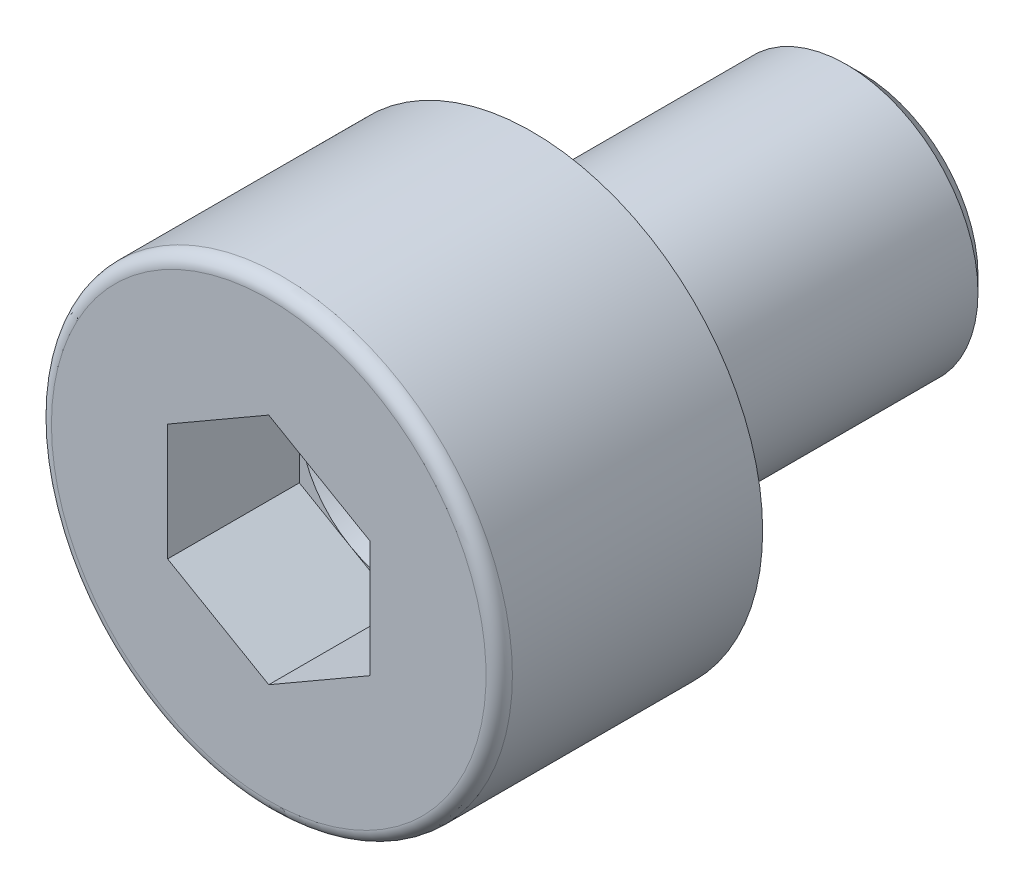
ISO-10303-21;
HEADER;
FILE_DESCRIPTION(('STEP AP214'),'2;1');
FILE_NAME('part.step','',(''),(''),'','','');
FILE_SCHEMA(('AUTOMOTIVE_DESIGN { 1 0 10303 214 1 1 1 1 }'));
ENDSEC;
DATA;
#1=APPLICATION_CONTEXT('core data for automotive mechanical design processes');
#2=APPLICATION_PROTOCOL_DEFINITION('international standard','automotive_design',2000,#1);
#3=PRODUCT_CONTEXT('',#1,'mechanical');
#4=PRODUCT('Part','Part','',(#3));
#5=PRODUCT_RELATED_PRODUCT_CATEGORY('part','',(#4));
#6=PRODUCT_DEFINITION_FORMATION('','',#4);
#7=PRODUCT_DEFINITION_CONTEXT('part definition',#1,'design');
#8=PRODUCT_DEFINITION('design','',#6,#7);
#9=PRODUCT_DEFINITION_SHAPE('','',#8);
#10=(LENGTH_UNIT() NAMED_UNIT(*) SI_UNIT(.MILLI.,.METRE.));
#11=(NAMED_UNIT(*) PLANE_ANGLE_UNIT() SI_UNIT($,.RADIAN.));
#12=(NAMED_UNIT(*) SI_UNIT($,.STERADIAN.) SOLID_ANGLE_UNIT());
#13=UNCERTAINTY_MEASURE_WITH_UNIT(LENGTH_MEASURE(1.E-05),#10,'distance_accuracy_value','');
#14=(GEOMETRIC_REPRESENTATION_CONTEXT(3) GLOBAL_UNCERTAINTY_ASSIGNED_CONTEXT((#13)) GLOBAL_UNIT_ASSIGNED_CONTEXT((#10,
#11,#12)) REPRESENTATION_CONTEXT('',''));
#15=CARTESIAN_POINT('',(0.,0.,0.));
#16=DIRECTION('',(0.,0.,1.));
#17=DIRECTION('',(1.,0.,0.));
#18=AXIS2_PLACEMENT_3D('',#15,#16,#17);
#19=CARTESIAN_POINT('',(0.,1.77304267668134,2.));
#20=DIRECTION('',(0.,0.,1.));
#21=DIRECTION('',(1.,0.,0.));
#22=AXIS2_PLACEMENT_3D('',#19,#20,#21);
#23=PLANE('',#22);
#24=DIRECTION('',(0.,-1.,0.));
#25=VECTOR('',#24,1.);
#26=CARTESIAN_POINT('',(-1.5355,0.886521338340671,2.));
#27=LINE('',#26,#25);
#28=CARTESIAN_POINT('',(-1.5355,0.886521338340671,2.));
#29=VERTEX_POINT('',#28);
#30=CARTESIAN_POINT('',(-1.5355,0.,2.));
#31=VERTEX_POINT('',#30);
#32=EDGE_CURVE('E145',#29,#31,#27,.T.);
#33=ORIENTED_EDGE('',*,*,#32,.T.);
#34=CARTESIAN_POINT('',(0.,0.,2.));
#35=DIRECTION('',(0.,0.,-1.));
#36=DIRECTION('',(-1.,0.,0.));
#37=AXIS2_PLACEMENT_3D('',#34,#35,#36);
#38=CIRCLE('',#37,1.5355);
#39=CARTESIAN_POINT('',(-0.76775,1.32978200751101,2.));
#40=VERTEX_POINT('',#39);
#41=EDGE_CURVE('E28',#31,#40,#38,.T.);
#42=ORIENTED_EDGE('',*,*,#41,.T.);
#43=DIRECTION('',(-0.866025403784439,-0.5,0.));
#44=VECTOR('',#43,1.);
#45=CARTESIAN_POINT('',(0.,1.77304267668134,2.));
#46=LINE('',#45,#44);
#47=EDGE_CURVE('E209',#40,#29,#46,.T.);
#48=ORIENTED_EDGE('',*,*,#47,.T.);
#49=EDGE_LOOP('',(#33,#42,#48));
#50=FACE_BOUND('',#49,.T.);
#51=ADVANCED_FACE('F17',(#50),#23,.T.);
#52=CARTESIAN_POINT('',(0.,1.77304267668134,2.));
#53=VERTEX_POINT('',#52);
#54=EDGE_CURVE('E214',#53,#40,#46,.T.);
#55=ORIENTED_EDGE('',*,*,#54,.T.);
#56=CARTESIAN_POINT('',(0.76775,1.32978200751101,2.));
#57=VERTEX_POINT('',#56);
#58=EDGE_CURVE('E11',#40,#57,#38,.T.);
#59=ORIENTED_EDGE('',*,*,#58,.T.);
#60=DIRECTION('',(-0.866025403784439,0.5,0.));
#61=VECTOR('',#60,1.);
#62=CARTESIAN_POINT('',(1.5355,0.886521338340671,2.));
#63=LINE('',#62,#61);
#64=EDGE_CURVE('E171',#57,#53,#63,.T.);
#65=ORIENTED_EDGE('',*,*,#64,.T.);
#66=EDGE_LOOP('',(#55,#59,#65));
#67=FACE_BOUND('',#66,.T.);
#68=ADVANCED_FACE('F106',(#67),#23,.T.);
#69=CARTESIAN_POINT('',(1.5355,0.886521338340671,2.));
#70=VERTEX_POINT('',#69);
#71=EDGE_CURVE('E215',#70,#57,#63,.T.);
#72=ORIENTED_EDGE('',*,*,#71,.T.);
#73=CARTESIAN_POINT('',(1.5355,0.,2.));
#74=VERTEX_POINT('',#73);
#75=EDGE_CURVE('E26',#57,#74,#38,.T.);
#76=ORIENTED_EDGE('',*,*,#75,.T.);
#77=DIRECTION('',(0.,1.,0.));
#78=VECTOR('',#77,1.);
#79=CARTESIAN_POINT('',(1.5355,-0.886521338340671,2.));
#80=LINE('',#79,#78);
#81=EDGE_CURVE('E150',#74,#70,#80,.T.);
#82=ORIENTED_EDGE('',*,*,#81,.T.);
#83=EDGE_LOOP('',(#72,#76,#82));
#84=FACE_BOUND('',#83,.T.);
#85=ADVANCED_FACE('F113',(#84),#23,.T.);
#86=CARTESIAN_POINT('',(1.5355,-0.886521338340671,2.));
#87=VERTEX_POINT('',#86);
#88=EDGE_CURVE('E151',#87,#74,#80,.T.);
#89=ORIENTED_EDGE('',*,*,#88,.T.);
#90=CARTESIAN_POINT('',(0.76775,-1.32978200751101,2.));
#91=VERTEX_POINT('',#90);
#92=EDGE_CURVE('E206',#74,#91,#38,.T.);
#93=ORIENTED_EDGE('',*,*,#92,.T.);
#94=DIRECTION('',(0.866025403784439,0.5,0.));
#95=VECTOR('',#94,1.);
#96=CARTESIAN_POINT('',(0.,-1.77304267668134,2.));
#97=LINE('',#96,#95);
#98=EDGE_CURVE('E140',#91,#87,#97,.T.);
#99=ORIENTED_EDGE('',*,*,#98,.T.);
#100=EDGE_LOOP('',(#89,#93,#99));
#101=FACE_BOUND('',#100,.T.);
#102=ADVANCED_FACE('F129',(#101),#23,.T.);
#103=CARTESIAN_POINT('',(0.,-1.77304267668134,2.));
#104=VERTEX_POINT('',#103);
#105=EDGE_CURVE('E143',#104,#91,#97,.T.);
#106=ORIENTED_EDGE('',*,*,#105,.T.);
#107=CARTESIAN_POINT('',(-0.76775,-1.329782007511,2.));
#108=VERTEX_POINT('',#107);
#109=EDGE_CURVE('E204',#91,#108,#38,.T.);
#110=ORIENTED_EDGE('',*,*,#109,.T.);
#111=DIRECTION('',(0.866025403784439,-0.5,0.));
#112=VECTOR('',#111,1.);
#113=CARTESIAN_POINT('',(-1.5355,-0.886521338340671,2.));
#114=LINE('',#113,#112);
#115=EDGE_CURVE('E141',#108,#104,#114,.T.);
#116=ORIENTED_EDGE('',*,*,#115,.T.);
#117=EDGE_LOOP('',(#106,#110,#116));
#118=FACE_BOUND('',#117,.T.);
#119=ADVANCED_FACE('F119',(#118),#23,.T.);
#120=CARTESIAN_POINT('',(-1.5355,-0.886521338340671,2.));
#121=VERTEX_POINT('',#120);
#122=EDGE_CURVE('E133',#121,#108,#114,.T.);
#123=ORIENTED_EDGE('',*,*,#122,.T.);
#124=EDGE_CURVE('E134',#108,#31,#38,.T.);
#125=ORIENTED_EDGE('',*,*,#124,.T.);
#126=EDGE_CURVE('E136',#31,#121,#27,.T.);
#127=ORIENTED_EDGE('',*,*,#126,.T.);
#128=EDGE_LOOP('',(#123,#125,#127));
#129=FACE_BOUND('',#128,.T.);
#130=ADVANCED_FACE('F108',(#129),#23,.T.);
#131=CARTESIAN_POINT('',(0.,0.,4.));
#132=DIRECTION('',(0.,0.,-1.));
#133=DIRECTION('',(-1.,0.,0.));
#134=AXIS2_PLACEMENT_3D('',#131,#132,#133);
#135=PLANE('',#134);
#136=DIRECTION('',(-0.866025403784439,-0.5,0.));
#137=VECTOR('',#136,1.);
#138=CARTESIAN_POINT('',(0.,1.77304267668134,4.));
#139=LINE('',#138,#137);
#140=CARTESIAN_POINT('',(0.,1.77304267668134,4.));
#141=VERTEX_POINT('',#140);
#142=CARTESIAN_POINT('',(-1.5355,0.886521338340671,4.));
#143=VERTEX_POINT('',#142);
#144=EDGE_CURVE('E156',#141,#143,#139,.T.);
#145=ORIENTED_EDGE('',*,*,#144,.F.);
#146=DIRECTION('',(-0.866025403784439,0.5,0.));
#147=VECTOR('',#146,1.);
#148=CARTESIAN_POINT('',(1.5355,0.886521338340671,4.));
#149=LINE('',#148,#147);
#150=CARTESIAN_POINT('',(1.5355,0.886521338340671,4.));
#151=VERTEX_POINT('',#150);
#152=EDGE_CURVE('E42',#151,#141,#149,.T.);
#153=ORIENTED_EDGE('',*,*,#152,.F.);
#154=DIRECTION('',(0.,1.,0.));
#155=VECTOR('',#154,1.);
#156=CARTESIAN_POINT('',(1.5355,-0.886521338340671,4.));
#157=LINE('',#156,#155);
#158=CARTESIAN_POINT('',(1.5355,-0.886521338340671,4.));
#159=VERTEX_POINT('',#158);
#160=EDGE_CURVE('E168',#159,#151,#157,.T.);
#161=ORIENTED_EDGE('',*,*,#160,.F.);
#162=DIRECTION('',(0.866025403784439,0.5,0.));
#163=VECTOR('',#162,1.);
#164=CARTESIAN_POINT('',(0.,-1.77304267668134,4.));
#165=LINE('',#164,#163);
#166=CARTESIAN_POINT('',(0.,-1.77304267668134,4.));
#167=VERTEX_POINT('',#166);
#168=EDGE_CURVE('E165',#167,#159,#165,.T.);
#169=ORIENTED_EDGE('',*,*,#168,.F.);
#170=DIRECTION('',(0.866025403784439,-0.5,0.));
#171=VECTOR('',#170,1.);
#172=CARTESIAN_POINT('',(-1.5355,-0.886521338340671,4.));
#173=LINE('',#172,#171);
#174=CARTESIAN_POINT('',(-1.5355,-0.886521338340671,4.));
#175=VERTEX_POINT('',#174);
#176=EDGE_CURVE('E162',#175,#167,#173,.T.);
#177=ORIENTED_EDGE('',*,*,#176,.F.);
#178=DIRECTION('',(0.,-1.,0.));
#179=VECTOR('',#178,1.);
#180=CARTESIAN_POINT('',(-1.5355,0.886521338340671,4.));
#181=LINE('',#180,#179);
#182=EDGE_CURVE('E159',#143,#175,#181,.T.);
#183=ORIENTED_EDGE('',*,*,#182,.F.);
#184=EDGE_LOOP('',(#145,#153,#161,#169,#177,#183));
#185=FACE_BOUND('',#184,.T.);
#186=CARTESIAN_POINT('',(0.,0.,4.));
#187=DIRECTION('',(0.,0.,-1.));
#188=DIRECTION('',(-1.,0.,0.));
#189=AXIS2_PLACEMENT_3D('',#186,#187,#188);
#190=CIRCLE('',#189,3.3);
#191=CARTESIAN_POINT('',(-3.3,0.,4.));
#192=VERTEX_POINT('',#191);
#193=EDGE_CURVE('E192',#192,#192,#190,.F.);
#194=ORIENTED_EDGE('',*,*,#193,.T.);
#195=EDGE_LOOP('',(#194));
#196=FACE_BOUND('',#195,.T.);
#197=ADVANCED_FACE('F118',(#185,#196),#135,.F.);
#198=CARTESIAN_POINT('',(0.,0.,4.));
#199=DIRECTION('',(0.,0.,1.));
#200=DIRECTION('',(1.,0.,0.));
#201=AXIS2_PLACEMENT_3D('',#198,#199,#200);
#202=CYLINDRICAL_SURFACE('',#201,3.5);
#203=CARTESIAN_POINT('',(0.,0.,3.8));
#204=DIRECTION('',(0.,0.,-1.));
#205=DIRECTION('',(-1.,0.,0.));
#206=AXIS2_PLACEMENT_3D('',#203,#204,#205);
#207=CIRCLE('',#206,3.5);
#208=CARTESIAN_POINT('',(-3.5,0.,3.8));
#209=VERTEX_POINT('',#208);
#210=EDGE_CURVE('E195',#209,#209,#207,.T.);
#211=ORIENTED_EDGE('',*,*,#210,.T.);
#212=EDGE_LOOP('',(#211));
#213=FACE_BOUND('',#212,.T.);
#214=CARTESIAN_POINT('',(0.,0.,0.));
#215=DIRECTION('',(0.,0.,1.));
#216=DIRECTION('',(1.,0.,0.));
#217=AXIS2_PLACEMENT_3D('',#214,#215,#216);
#218=CIRCLE('',#217,3.5);
#219=CARTESIAN_POINT('',(3.5,0.,0.));
#220=VERTEX_POINT('',#219);
#221=EDGE_CURVE('E174',#220,#220,#218,.T.);
#222=ORIENTED_EDGE('',*,*,#221,.T.);
#223=EDGE_LOOP('',(#222));
#224=FACE_BOUND('',#223,.T.);
#225=ADVANCED_FACE('F126',(#213,#224),#202,.T.);
#226=CARTESIAN_POINT('',(0.,3.5,0.));
#227=DIRECTION('',(0.,0.,1.));
#228=DIRECTION('',(1.,0.,0.));
#229=AXIS2_PLACEMENT_3D('',#226,#227,#228);
#230=PLANE('',#229);
#231=CARTESIAN_POINT('',(0.,0.,0.));
#232=DIRECTION('',(0.,0.,1.));
#233=DIRECTION('',(1.,0.,0.));
#234=AXIS2_PLACEMENT_3D('',#231,#232,#233);
#235=CIRCLE('',#234,2.2);
#236=CARTESIAN_POINT('',(2.2,0.,0.));
#237=VERTEX_POINT('',#236);
#238=EDGE_CURVE('E197',#237,#237,#235,.T.);
#239=ORIENTED_EDGE('',*,*,#238,.T.);
#240=EDGE_LOOP('',(#239));
#241=FACE_BOUND('',#240,.T.);
#242=ORIENTED_EDGE('',*,*,#221,.F.);
#243=EDGE_LOOP('',(#242));
#244=FACE_BOUND('',#243,.T.);
#245=ADVANCED_FACE('F264',(#241,#244),#230,.F.);
#246=CARTESIAN_POINT('',(0.,0.,4.));
#247=DIRECTION('',(0.,0.,1.));
#248=DIRECTION('',(1.,0.,0.));
#249=AXIS2_PLACEMENT_3D('',#246,#247,#248);
#250=CYLINDRICAL_SURFACE('',#249,2.);
#251=CARTESIAN_POINT('',(0.,0.,-0.2));
#252=DIRECTION('',(0.,0.,1.));
#253=DIRECTION('',(1.,0.,0.));
#254=AXIS2_PLACEMENT_3D('',#251,#252,#253);
#255=CIRCLE('',#254,2.);
#256=CARTESIAN_POINT('',(2.,0.,-0.2));
#257=VERTEX_POINT('',#256);
#258=EDGE_CURVE('E21',#257,#257,#255,.F.);
#259=ORIENTED_EDGE('',*,*,#258,.T.);
#260=EDGE_LOOP('',(#259));
#261=FACE_BOUND('',#260,.T.);
#262=CARTESIAN_POINT('',(0.,0.,-4.77));
#263=DIRECTION('',(0.,0.,1.));
#264=DIRECTION('',(1.,0.,0.));
#265=AXIS2_PLACEMENT_3D('',#262,#263,#264);
#266=CIRCLE('',#265,2.);
#267=CARTESIAN_POINT('',(2.,0.,-4.77));
#268=VERTEX_POINT('',#267);
#269=EDGE_CURVE('E186',#268,#268,#266,.T.);
#270=ORIENTED_EDGE('',*,*,#269,.T.);
#271=EDGE_LOOP('',(#270));
#272=FACE_BOUND('',#271,.T.);
#273=ADVANCED_FACE('F260',(#261,#272),#250,.T.);
#274=CARTESIAN_POINT('',(0.,2.,-5.));
#275=DIRECTION('',(0.,0.,1.));
#276=DIRECTION('',(1.,0.,0.));
#277=AXIS2_PLACEMENT_3D('',#274,#275,#276);
#278=PLANE('',#277);
#279=CARTESIAN_POINT('',(0.,0.,-5.));
#280=DIRECTION('',(0.,0.,1.));
#281=DIRECTION('',(1.,0.,0.));
#282=AXIS2_PLACEMENT_3D('',#279,#280,#281);
#283=CIRCLE('',#282,1.77);
#284=CARTESIAN_POINT('',(1.77,0.,-5.));
#285=VERTEX_POINT('',#284);
#286=EDGE_CURVE('E189',#285,#285,#283,.F.);
#287=ORIENTED_EDGE('',*,*,#286,.T.);
#288=EDGE_LOOP('',(#287));
#289=FACE_BOUND('',#288,.T.);
#290=ADVANCED_FACE('F256',(#289),#278,.F.);
#291=CARTESIAN_POINT('',(0.,0.,-4.77));
#292=DIRECTION('',(0.,0.,1.));
#293=DIRECTION('',(1.,0.,0.));
#294=AXIS2_PLACEMENT_3D('',#291,#292,#293);
#295=CONICAL_SURFACE('',#294,2.,0.785398163397448);
#296=ORIENTED_EDGE('',*,*,#286,.F.);
#297=EDGE_LOOP('',(#296));
#298=FACE_BOUND('',#297,.T.);
#299=ORIENTED_EDGE('',*,*,#269,.F.);
#300=EDGE_LOOP('',(#299));
#301=FACE_BOUND('',#300,.T.);
#302=ADVANCED_FACE('F259',(#298,#301),#295,.T.);
#303=CARTESIAN_POINT('',(0.,0.,3.8));
#304=DIRECTION('',(0.,0.,-1.));
#305=DIRECTION('',(-1.,0.,0.));
#306=AXIS2_PLACEMENT_3D('',#303,#304,#305);
#307=TOROIDAL_SURFACE('',#306,3.3,0.2);
#308=ORIENTED_EDGE('',*,*,#210,.F.);
#309=EDGE_LOOP('',(#308));
#310=FACE_BOUND('',#309,.T.);
#311=ORIENTED_EDGE('',*,*,#193,.F.);
#312=EDGE_LOOP('',(#311));
#313=FACE_BOUND('',#312,.T.);
#314=ADVANCED_FACE('F271',(#310,#313),#307,.T.);
#315=CARTESIAN_POINT('',(0.,0.,-0.2));
#316=DIRECTION('',(0.,0.,1.));
#317=DIRECTION('',(1.,0.,0.));
#318=AXIS2_PLACEMENT_3D('',#315,#316,#317);
#319=TOROIDAL_SURFACE('',#318,2.2,0.2);
#320=ORIENTED_EDGE('',*,*,#258,.F.);
#321=EDGE_LOOP('',(#320));
#322=FACE_BOUND('',#321,.T.);
#323=ORIENTED_EDGE('',*,*,#238,.F.);
#324=EDGE_LOOP('',(#323));
#325=FACE_BOUND('',#324,.T.);
#326=ADVANCED_FACE('F19',(#322,#325),#319,.F.);
#327=CARTESIAN_POINT('',(1.5355,0.886521338340671,2.));
#328=DIRECTION('',(0.5,0.866025403784439,0.));
#329=DIRECTION('',(-0.866025403784439,0.5,0.));
#330=AXIS2_PLACEMENT_3D('',#327,#328,#329);
#331=PLANE('',#330);
#332=ORIENTED_EDGE('',*,*,#152,.T.);
#333=DIRECTION('',(0.,0.,1.));
#334=VECTOR('',#333,1.);
#335=CARTESIAN_POINT('',(0.,1.77304267668134,2.));
#336=LINE('',#335,#334);
#337=EDGE_CURVE('E154',#53,#141,#336,.T.);
#338=ORIENTED_EDGE('',*,*,#337,.F.);
#339=ORIENTED_EDGE('',*,*,#64,.F.);
#340=ORIENTED_EDGE('',*,*,#71,.F.);
#341=DIRECTION('',(0.,0.,1.));
#342=VECTOR('',#341,1.);
#343=CARTESIAN_POINT('',(1.5355,0.886521338340671,2.));
#344=LINE('',#343,#342);
#345=EDGE_CURVE('E172',#70,#151,#344,.T.);
#346=ORIENTED_EDGE('',*,*,#345,.T.);
#347=EDGE_LOOP('',(#332,#338,#339,#340,#346));
#348=FACE_BOUND('',#347,.T.);
#349=ADVANCED_FACE('F223',(#348),#331,.F.);
#350=CARTESIAN_POINT('',(1.5355,-0.886521338340671,2.));
#351=DIRECTION('',(1.,0.,0.));
#352=DIRECTION('',(0.,1.,0.));
#353=AXIS2_PLACEMENT_3D('',#350,#351,#352);
#354=PLANE('',#353);
#355=ORIENTED_EDGE('',*,*,#160,.T.);
#356=ORIENTED_EDGE('',*,*,#345,.F.);
#357=ORIENTED_EDGE('',*,*,#81,.F.);
#358=ORIENTED_EDGE('',*,*,#88,.F.);
#359=DIRECTION('',(0.,0.,1.));
#360=VECTOR('',#359,1.);
#361=CARTESIAN_POINT('',(1.5355,-0.886521338340671,2.));
#362=LINE('',#361,#360);
#363=EDGE_CURVE('E175',#87,#159,#362,.T.);
#364=ORIENTED_EDGE('',*,*,#363,.T.);
#365=EDGE_LOOP('',(#355,#356,#357,#358,#364));
#366=FACE_BOUND('',#365,.T.);
#367=ADVANCED_FACE('F242',(#366),#354,.F.);
#368=CARTESIAN_POINT('',(0.,-1.77304267668134,2.));
#369=DIRECTION('',(0.5,-0.866025403784439,0.));
#370=DIRECTION('',(0.866025403784439,0.5,0.));
#371=AXIS2_PLACEMENT_3D('',#368,#369,#370);
#372=PLANE('',#371);
#373=ORIENTED_EDGE('',*,*,#168,.T.);
#374=ORIENTED_EDGE('',*,*,#363,.F.);
#375=ORIENTED_EDGE('',*,*,#98,.F.);
#376=ORIENTED_EDGE('',*,*,#105,.F.);
#377=DIRECTION('',(0.,0.,1.));
#378=VECTOR('',#377,1.);
#379=CARTESIAN_POINT('',(0.,-1.77304267668134,2.));
#380=LINE('',#379,#378);
#381=EDGE_CURVE('E177',#104,#167,#380,.T.);
#382=ORIENTED_EDGE('',*,*,#381,.T.);
#383=EDGE_LOOP('',(#373,#374,#375,#376,#382));
#384=FACE_BOUND('',#383,.T.);
#385=ADVANCED_FACE('F236',(#384),#372,.F.);
#386=CARTESIAN_POINT('',(-1.5355,-0.886521338340671,2.));
#387=DIRECTION('',(-0.5,-0.866025403784439,0.));
#388=DIRECTION('',(0.866025403784439,-0.5,0.));
#389=AXIS2_PLACEMENT_3D('',#386,#387,#388);
#390=PLANE('',#389);
#391=ORIENTED_EDGE('',*,*,#176,.T.);
#392=ORIENTED_EDGE('',*,*,#381,.F.);
#393=ORIENTED_EDGE('',*,*,#115,.F.);
#394=ORIENTED_EDGE('',*,*,#122,.F.);
#395=DIRECTION('',(0.,0.,1.));
#396=VECTOR('',#395,1.);
#397=CARTESIAN_POINT('',(-1.5355,-0.886521338340671,2.));
#398=LINE('',#397,#396);
#399=EDGE_CURVE('E179',#121,#175,#398,.T.);
#400=ORIENTED_EDGE('',*,*,#399,.T.);
#401=EDGE_LOOP('',(#391,#392,#393,#394,#400));
#402=FACE_BOUND('',#401,.T.);
#403=ADVANCED_FACE('F231',(#402),#390,.F.);
#404=CARTESIAN_POINT('',(-1.5355,0.886521338340671,2.));
#405=DIRECTION('',(-1.,0.,0.));
#406=DIRECTION('',(0.,0.,1.));
#407=AXIS2_PLACEMENT_3D('',#404,#405,#406);
#408=PLANE('',#407);
#409=ORIENTED_EDGE('',*,*,#182,.T.);
#410=ORIENTED_EDGE('',*,*,#399,.F.);
#411=ORIENTED_EDGE('',*,*,#126,.F.);
#412=ORIENTED_EDGE('',*,*,#32,.F.);
#413=DIRECTION('',(0.,0.,1.));
#414=VECTOR('',#413,1.);
#415=CARTESIAN_POINT('',(-1.5355,0.886521338340671,2.));
#416=LINE('',#415,#414);
#417=EDGE_CURVE('E181',#29,#143,#416,.T.);
#418=ORIENTED_EDGE('',*,*,#417,.T.);
#419=EDGE_LOOP('',(#409,#410,#411,#412,#418));
#420=FACE_BOUND('',#419,.T.);
#421=ADVANCED_FACE('F101',(#420),#408,.F.);
#422=CARTESIAN_POINT('',(0.,1.77304267668134,2.));
#423=DIRECTION('',(-0.5,0.866025403784439,0.));
#424=DIRECTION('',(-0.866025403784439,-0.5,0.));
#425=AXIS2_PLACEMENT_3D('',#422,#423,#424);
#426=PLANE('',#425);
#427=ORIENTED_EDGE('',*,*,#144,.T.);
#428=ORIENTED_EDGE('',*,*,#417,.F.);
#429=ORIENTED_EDGE('',*,*,#47,.F.);
#430=ORIENTED_EDGE('',*,*,#54,.F.);
#431=ORIENTED_EDGE('',*,*,#337,.T.);
#432=EDGE_LOOP('',(#427,#428,#429,#430,#431));
#433=FACE_BOUND('',#432,.T.);
#434=ADVANCED_FACE('F94',(#433),#426,.F.);
#435=CARTESIAN_POINT('',(0.,0.,1.11347866165933));
#436=DIRECTION('',(0.,0.,1.));
#437=DIRECTION('',(1.,0.,0.));
#438=AXIS2_PLACEMENT_3D('',#435,#436,#437);
#439=CONICAL_SURFACE('',#438,0.,1.0471975511966);
#440=ORIENTED_EDGE('',*,*,#41,.F.);
#441=ORIENTED_EDGE('',*,*,#124,.F.);
#442=ORIENTED_EDGE('',*,*,#109,.F.);
#443=ORIENTED_EDGE('',*,*,#92,.F.);
#444=ORIENTED_EDGE('',*,*,#75,.F.);
#445=ORIENTED_EDGE('',*,*,#58,.F.);
#446=EDGE_LOOP('',(#440,#441,#442,#443,#444,#445));
#447=FACE_BOUND('',#446,.T.);
#448=CARTESIAN_POINT('',(0.,0.,1.11347866165933));
#449=VERTEX_POINT('',#448);
#450=VERTEX_LOOP('',#449);
#451=FACE_BOUND('',#450,.T.);
#452=ADVANCED_FACE('F92',(#447,#451),#439,.F.);
#453=CLOSED_SHELL('',(#51,#68,#85,#102,#119,#130,#197,#225,#245,#273,#290,#302,#314,#326,#349,
#367,#385,#403,#421,#434,#452));
#454=MANIFOLD_SOLID_BREP('B1',#453);
#455=ADVANCED_BREP_SHAPE_REPRESENTATION('',(#18,#454),#14);
#456=SHAPE_DEFINITION_REPRESENTATION(#9,#455);
ENDSEC;
END-ISO-10303-21;
